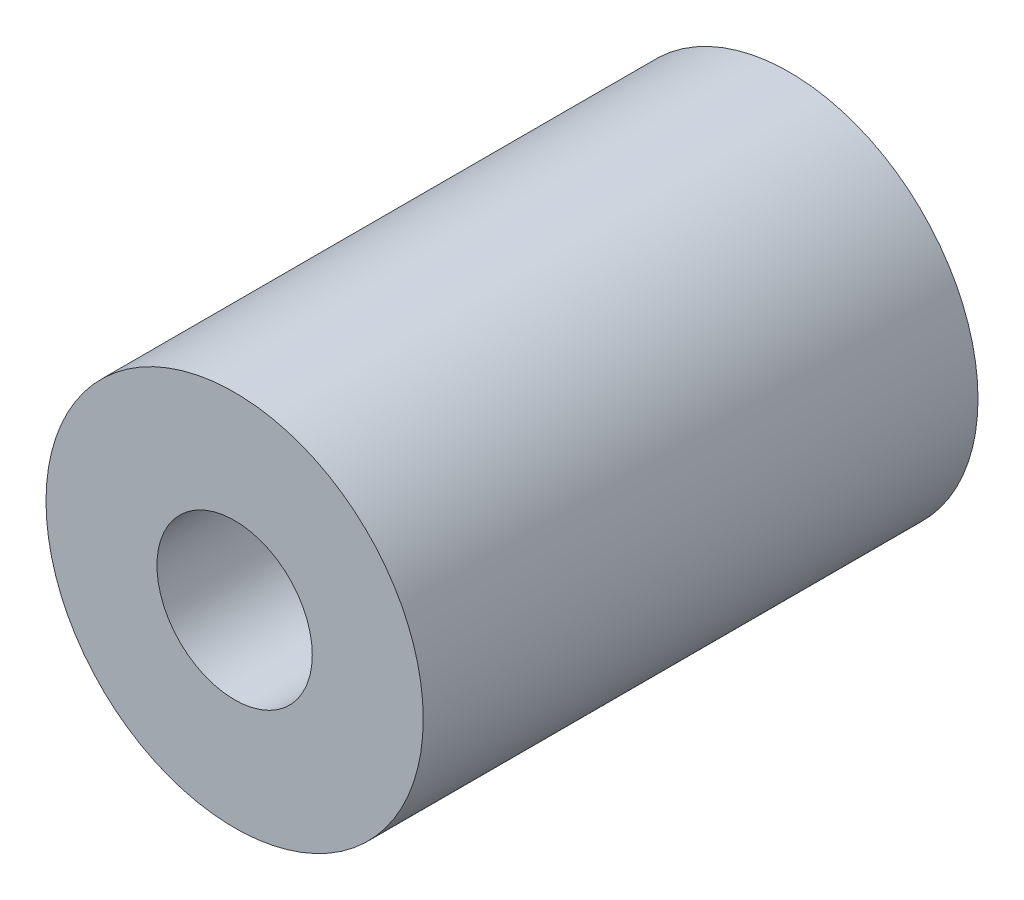
ISO-10303-21;
HEADER;
FILE_DESCRIPTION(('STEP AP214'),'2;1');
FILE_NAME('part.step','',(''),(''),'','','');
FILE_SCHEMA(('AUTOMOTIVE_DESIGN { 1 0 10303 214 1 1 1 1 }'));
ENDSEC;
DATA;
#1=APPLICATION_CONTEXT('core data for automotive mechanical design processes');
#2=APPLICATION_PROTOCOL_DEFINITION('international standard','automotive_design',2000,#1);
#3=PRODUCT_CONTEXT('',#1,'mechanical');
#4=PRODUCT('Part','Part','',(#3));
#5=PRODUCT_RELATED_PRODUCT_CATEGORY('part','',(#4));
#6=PRODUCT_DEFINITION_FORMATION('','',#4);
#7=PRODUCT_DEFINITION_CONTEXT('part definition',#1,'design');
#8=PRODUCT_DEFINITION('design','',#6,#7);
#9=PRODUCT_DEFINITION_SHAPE('','',#8);
#10=(LENGTH_UNIT() NAMED_UNIT(*) SI_UNIT(.MILLI.,.METRE.));
#11=(NAMED_UNIT(*) PLANE_ANGLE_UNIT() SI_UNIT($,.RADIAN.));
#12=(NAMED_UNIT(*) SI_UNIT($,.STERADIAN.) SOLID_ANGLE_UNIT());
#13=UNCERTAINTY_MEASURE_WITH_UNIT(LENGTH_MEASURE(1.E-05),#10,'distance_accuracy_value','');
#14=(GEOMETRIC_REPRESENTATION_CONTEXT(3) GLOBAL_UNCERTAINTY_ASSIGNED_CONTEXT((#13)) GLOBAL_UNIT_ASSIGNED_CONTEXT((#10,
#11,#12)) REPRESENTATION_CONTEXT('',''));
#15=CARTESIAN_POINT('',(0.,0.,0.));
#16=DIRECTION('',(0.,0.,1.));
#17=DIRECTION('',(1.,0.,0.));
#18=AXIS2_PLACEMENT_3D('',#15,#16,#17);
#19=CARTESIAN_POINT('',(0.,0.,5.));
#20=DIRECTION('',(0.,0.,1.));
#21=DIRECTION('',(1.,0.,0.));
#22=AXIS2_PLACEMENT_3D('',#19,#20,#21);
#23=PLANE('',#22);
#24=CARTESIAN_POINT('',(0.,0.,5.));
#25=DIRECTION('',(0.,0.,1.));
#26=DIRECTION('',(1.,0.,0.));
#27=AXIS2_PLACEMENT_3D('',#24,#25,#26);
#28=CIRCLE('',#27,3.4);
#29=CARTESIAN_POINT('',(3.4,0.,5.));
#30=VERTEX_POINT('',#29);
#31=EDGE_CURVE('E10',#30,#30,#28,.T.);
#32=ORIENTED_EDGE('',*,*,#31,.T.);
#33=EDGE_LOOP('',(#32));
#34=FACE_BOUND('',#33,.T.);
#35=CARTESIAN_POINT('',(0.,0.,5.));
#36=DIRECTION('',(0.,0.,1.));
#37=DIRECTION('',(1.,0.,0.));
#38=AXIS2_PLACEMENT_3D('',#35,#36,#37);
#39=CIRCLE('',#38,1.4);
#40=CARTESIAN_POINT('',(1.4,0.,5.));
#41=VERTEX_POINT('',#40);
#42=EDGE_CURVE('E41',#41,#41,#39,.T.);
#43=ORIENTED_EDGE('',*,*,#42,.F.);
#44=EDGE_LOOP('',(#43));
#45=FACE_BOUND('',#44,.T.);
#46=ADVANCED_FACE('F30',(#34,#45),#23,.T.);
#47=CARTESIAN_POINT('',(0.,0.,-5.));
#48=DIRECTION('',(0.,0.,1.));
#49=DIRECTION('',(1.,0.,0.));
#50=AXIS2_PLACEMENT_3D('',#47,#48,#49);
#51=PLANE('',#50);
#52=CARTESIAN_POINT('',(0.,0.,-5.));
#53=DIRECTION('',(0.,0.,1.));
#54=DIRECTION('',(1.,0.,0.));
#55=AXIS2_PLACEMENT_3D('',#52,#53,#54);
#56=CIRCLE('',#55,3.4);
#57=CARTESIAN_POINT('',(3.4,0.,-5.));
#58=VERTEX_POINT('',#57);
#59=EDGE_CURVE('E34',#58,#58,#56,.T.);
#60=ORIENTED_EDGE('',*,*,#59,.F.);
#61=EDGE_LOOP('',(#60));
#62=FACE_BOUND('',#61,.T.);
#63=CARTESIAN_POINT('',(0.,0.,-5.));
#64=DIRECTION('',(0.,0.,1.));
#65=DIRECTION('',(1.,0.,0.));
#66=AXIS2_PLACEMENT_3D('',#63,#64,#65);
#67=CIRCLE('',#66,1.4);
#68=CARTESIAN_POINT('',(1.4,0.,-5.));
#69=VERTEX_POINT('',#68);
#70=EDGE_CURVE('E43',#69,#69,#67,.T.);
#71=ORIENTED_EDGE('',*,*,#70,.T.);
#72=EDGE_LOOP('',(#71));
#73=FACE_BOUND('',#72,.T.);
#74=ADVANCED_FACE('F53',(#62,#73),#51,.F.);
#75=CARTESIAN_POINT('',(0.,0.,5.));
#76=DIRECTION('',(0.,0.,-1.));
#77=DIRECTION('',(-1.,0.,0.));
#78=AXIS2_PLACEMENT_3D('',#75,#76,#77);
#79=CYLINDRICAL_SURFACE('',#78,3.4);
#80=ORIENTED_EDGE('',*,*,#31,.F.);
#81=EDGE_LOOP('',(#80));
#82=FACE_BOUND('',#81,.T.);
#83=ORIENTED_EDGE('',*,*,#59,.T.);
#84=EDGE_LOOP('',(#83));
#85=FACE_BOUND('',#84,.T.);
#86=ADVANCED_FACE('F32',(#82,#85),#79,.T.);
#87=CARTESIAN_POINT('',(0.,0.,5.));
#88=DIRECTION('',(0.,0.,-1.));
#89=DIRECTION('',(-1.,0.,0.));
#90=AXIS2_PLACEMENT_3D('',#87,#88,#89);
#91=CYLINDRICAL_SURFACE('',#90,1.4);
#92=ORIENTED_EDGE('',*,*,#42,.T.);
#93=EDGE_LOOP('',(#92));
#94=FACE_BOUND('',#93,.T.);
#95=ORIENTED_EDGE('',*,*,#70,.F.);
#96=EDGE_LOOP('',(#95));
#97=FACE_BOUND('',#96,.T.);
#98=ADVANCED_FACE('F49',(#94,#97),#91,.F.);
#99=CLOSED_SHELL('',(#46,#74,#86,#98));
#100=MANIFOLD_SOLID_BREP('B2',#99);
#101=ADVANCED_BREP_SHAPE_REPRESENTATION('',(#18,#100),#14);
#102=SHAPE_DEFINITION_REPRESENTATION(#9,#101);
ENDSEC;
END-ISO-10303-21;
